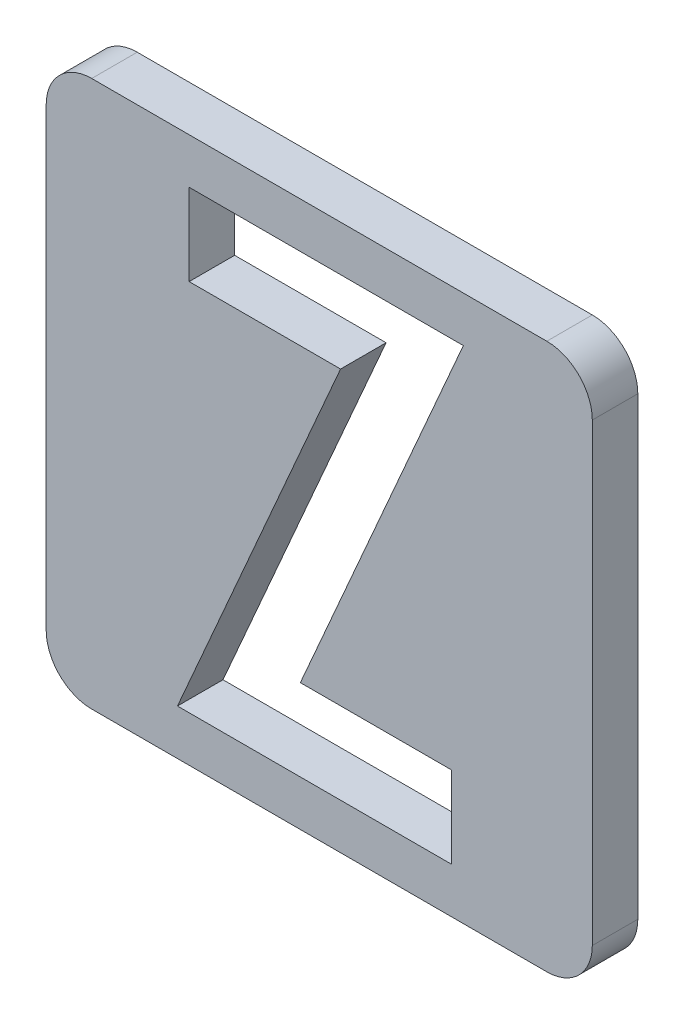
ISO-10303-21;
HEADER;
FILE_DESCRIPTION(('STEP AP214'),'2;1');
FILE_NAME('part.step','',(''),(''),'','','');
FILE_SCHEMA(('AUTOMOTIVE_DESIGN { 1 0 10303 214 1 1 1 1 }'));
ENDSEC;
DATA;
#1=APPLICATION_CONTEXT('core data for automotive mechanical design processes');
#2=APPLICATION_PROTOCOL_DEFINITION('international standard','automotive_design',2000,#1);
#3=PRODUCT_CONTEXT('',#1,'mechanical');
#4=PRODUCT('Part','Part','',(#3));
#5=PRODUCT_RELATED_PRODUCT_CATEGORY('part','',(#4));
#6=PRODUCT_DEFINITION_FORMATION('','',#4);
#7=PRODUCT_DEFINITION_CONTEXT('part definition',#1,'design');
#8=PRODUCT_DEFINITION('design','',#6,#7);
#9=PRODUCT_DEFINITION_SHAPE('','',#8);
#10=(LENGTH_UNIT() NAMED_UNIT(*) SI_UNIT(.MILLI.,.METRE.));
#11=(NAMED_UNIT(*) PLANE_ANGLE_UNIT() SI_UNIT($,.RADIAN.));
#12=(NAMED_UNIT(*) SI_UNIT($,.STERADIAN.) SOLID_ANGLE_UNIT());
#13=UNCERTAINTY_MEASURE_WITH_UNIT(LENGTH_MEASURE(1.E-05),#10,'distance_accuracy_value','');
#14=(GEOMETRIC_REPRESENTATION_CONTEXT(3) GLOBAL_UNCERTAINTY_ASSIGNED_CONTEXT((#13)) GLOBAL_UNIT_ASSIGNED_CONTEXT((#10,
#11,#12)) REPRESENTATION_CONTEXT('',''));
#15=CARTESIAN_POINT('',(0.,0.,0.));
#16=DIRECTION('',(0.,0.,1.));
#17=DIRECTION('',(1.,0.,0.));
#18=AXIS2_PLACEMENT_3D('',#15,#16,#17);
#19=CARTESIAN_POINT('',(50.,50.,10.));
#20=DIRECTION('',(0.,0.,-1.));
#21=DIRECTION('',(-1.,0.,0.));
#22=AXIS2_PLACEMENT_3D('',#19,#20,#21);
#23=PLANE('',#22);
#24=DIRECTION('',(1.,0.,0.));
#25=VECTOR('',#24,1.);
#26=CARTESIAN_POINT('',(-49.9999999999999,60.,10.));
#27=LINE('',#26,#25);
#28=CARTESIAN_POINT('',(-49.9999999999999,60.,10.));
#29=VERTEX_POINT('',#28);
#30=CARTESIAN_POINT('',(49.9999999999999,60.,10.));
#31=VERTEX_POINT('',#30);
#32=EDGE_CURVE('E213',#29,#31,#27,.T.);
#33=ORIENTED_EDGE('',*,*,#32,.F.);
#34=CARTESIAN_POINT('',(-50.,50.,10.));
#35=DIRECTION('',(0.,0.,1.));
#36=DIRECTION('',(1.,0.,0.));
#37=AXIS2_PLACEMENT_3D('',#34,#35,#36);
#38=CIRCLE('',#37,10.);
#39=CARTESIAN_POINT('',(-60.,49.9999999999999,10.));
#40=VERTEX_POINT('',#39);
#41=EDGE_CURVE('E231',#29,#40,#38,.T.);
#42=ORIENTED_EDGE('',*,*,#41,.T.);
#43=DIRECTION('',(0.,-1.,0.));
#44=VECTOR('',#43,1.);
#45=CARTESIAN_POINT('',(-60.,49.9999999999999,10.));
#46=LINE('',#45,#44);
#47=CARTESIAN_POINT('',(-60.,-49.9999999999999,10.));
#48=VERTEX_POINT('',#47);
#49=EDGE_CURVE('E229',#40,#48,#46,.T.);
#50=ORIENTED_EDGE('',*,*,#49,.T.);
#51=CARTESIAN_POINT('',(-50.,-50.,10.));
#52=DIRECTION('',(0.,0.,1.));
#53=DIRECTION('',(1.,0.,0.));
#54=AXIS2_PLACEMENT_3D('',#51,#52,#53);
#55=CIRCLE('',#54,10.);
#56=CARTESIAN_POINT('',(-49.9999999999999,-60.,10.));
#57=VERTEX_POINT('',#56);
#58=EDGE_CURVE('E227',#48,#57,#55,.T.);
#59=ORIENTED_EDGE('',*,*,#58,.T.);
#60=DIRECTION('',(1.,0.,0.));
#61=VECTOR('',#60,1.);
#62=CARTESIAN_POINT('',(-49.9999999999999,-60.,10.));
#63=LINE('',#62,#61);
#64=CARTESIAN_POINT('',(49.9999999999999,-60.,10.));
#65=VERTEX_POINT('',#64);
#66=EDGE_CURVE('E225',#57,#65,#63,.T.);
#67=ORIENTED_EDGE('',*,*,#66,.T.);
#68=CARTESIAN_POINT('',(50.,-50.,10.));
#69=DIRECTION('',(0.,0.,1.));
#70=DIRECTION('',(1.,0.,0.));
#71=AXIS2_PLACEMENT_3D('',#68,#69,#70);
#72=CIRCLE('',#71,10.);
#73=CARTESIAN_POINT('',(60.,-50.,10.));
#74=VERTEX_POINT('',#73);
#75=EDGE_CURVE('E223',#65,#74,#72,.T.);
#76=ORIENTED_EDGE('',*,*,#75,.T.);
#77=DIRECTION('',(0.,-1.,0.));
#78=VECTOR('',#77,1.);
#79=CARTESIAN_POINT('',(60.,49.9999999999999,10.));
#80=LINE('',#79,#78);
#81=CARTESIAN_POINT('',(60.,49.9999999999999,10.));
#82=VERTEX_POINT('',#81);
#83=EDGE_CURVE('E220',#82,#74,#80,.T.);
#84=ORIENTED_EDGE('',*,*,#83,.F.);
#85=CARTESIAN_POINT('',(50.,50.,10.));
#86=DIRECTION('',(0.,0.,-1.));
#87=DIRECTION('',(-1.,0.,0.));
#88=AXIS2_PLACEMENT_3D('',#85,#86,#87);
#89=CIRCLE('',#88,10.);
#90=EDGE_CURVE('E216',#31,#82,#89,.T.);
#91=ORIENTED_EDGE('',*,*,#90,.F.);
#92=EDGE_LOOP('',(#33,#42,#50,#59,#67,#76,#84,#91));
#93=FACE_BOUND('',#92,.T.);
#94=DIRECTION('',(0.,1.,0.));
#95=VECTOR('',#94,1.);
#96=CARTESIAN_POINT('',(-28.5897435897436,32.0512820512821,10.));
#97=LINE('',#96,#95);
#98=CARTESIAN_POINT('',(-28.5897435897436,32.0512820512821,10.));
#99=VERTEX_POINT('',#98);
#100=CARTESIAN_POINT('',(-28.5897435897436,50.,10.));
#101=VERTEX_POINT('',#100);
#102=EDGE_CURVE('E50',#99,#101,#97,.T.);
#103=ORIENTED_EDGE('',*,*,#102,.T.);
#104=DIRECTION('',(1.,0.,0.));
#105=VECTOR('',#104,1.);
#106=CARTESIAN_POINT('',(-28.5897435897436,50.,10.));
#107=LINE('',#106,#105);
#108=CARTESIAN_POINT('',(31.6666666666667,50.,10.));
#109=VERTEX_POINT('',#108);
#110=EDGE_CURVE('E162',#101,#109,#107,.T.);
#111=ORIENTED_EDGE('',*,*,#110,.T.);
#112=DIRECTION('',(-0.400067481501263,-0.916485684691931,0.));
#113=VECTOR('',#112,1.);
#114=CARTESIAN_POINT('',(31.6666666666667,50.,10.));
#115=LINE('',#114,#113);
#116=CARTESIAN_POINT('',(-4.15064102564103,-32.0512820512821,10.));
#117=VERTEX_POINT('',#116);
#118=EDGE_CURVE('E185',#109,#117,#115,.T.);
#119=ORIENTED_EDGE('',*,*,#118,.T.);
#120=DIRECTION('',(1.,0.,0.));
#121=VECTOR('',#120,1.);
#122=CARTESIAN_POINT('',(-4.15064102564103,-32.0512820512821,10.));
#123=LINE('',#122,#121);
#124=CARTESIAN_POINT('',(29.1025641025641,-32.0512820512821,10.));
#125=VERTEX_POINT('',#124);
#126=EDGE_CURVE('E188',#117,#125,#123,.T.);
#127=ORIENTED_EDGE('',*,*,#126,.T.);
#128=DIRECTION('',(0.,-1.,0.));
#129=VECTOR('',#128,1.);
#130=CARTESIAN_POINT('',(29.1025641025641,-32.0512820512821,10.));
#131=LINE('',#130,#129);
#132=CARTESIAN_POINT('',(29.1025641025641,-50.,10.));
#133=VERTEX_POINT('',#132);
#134=EDGE_CURVE('E191',#125,#133,#131,.T.);
#135=ORIENTED_EDGE('',*,*,#134,.T.);
#136=DIRECTION('',(-1.,0.,0.));
#137=VECTOR('',#136,1.);
#138=CARTESIAN_POINT('',(29.1025641025641,-50.,10.));
#139=LINE('',#138,#137);
#140=CARTESIAN_POINT('',(-31.1538461538462,-50.,10.));
#141=VERTEX_POINT('',#140);
#142=EDGE_CURVE('E194',#133,#141,#139,.T.);
#143=ORIENTED_EDGE('',*,*,#142,.T.);
#144=DIRECTION('',(0.400255395350612,0.916403632954783,0.));
#145=VECTOR('',#144,1.);
#146=CARTESIAN_POINT('',(-31.1538461538462,-50.,10.));
#147=LINE('',#146,#145);
#148=CARTESIAN_POINT('',(4.68349358974358,32.0512820512821,10.));
#149=VERTEX_POINT('',#148);
#150=EDGE_CURVE('E197',#141,#149,#147,.T.);
#151=ORIENTED_EDGE('',*,*,#150,.T.);
#152=DIRECTION('',(-1.,0.,0.));
#153=VECTOR('',#152,1.);
#154=CARTESIAN_POINT('',(4.68349358974358,32.0512820512821,10.));
#155=LINE('',#154,#153);
#156=EDGE_CURVE('E156',#149,#99,#155,.T.);
#157=ORIENTED_EDGE('',*,*,#156,.T.);
#158=EDGE_LOOP('',(#103,#111,#119,#127,#135,#143,#151,#157));
#159=FACE_BOUND('',#158,.T.);
#160=ADVANCED_FACE('F33',(#93,#159),#23,.F.);
#161=CARTESIAN_POINT('',(50.,50.,0.));
#162=DIRECTION('',(0.,0.,-1.));
#163=DIRECTION('',(-1.,0.,0.));
#164=AXIS2_PLACEMENT_3D('',#161,#162,#163);
#165=PLANE('',#164);
#166=DIRECTION('',(1.,0.,0.));
#167=VECTOR('',#166,1.);
#168=CARTESIAN_POINT('',(-49.9999999999999,60.,0.));
#169=LINE('',#168,#167);
#170=CARTESIAN_POINT('',(-49.9999999999999,60.,0.));
#171=VERTEX_POINT('',#170);
#172=CARTESIAN_POINT('',(49.9999999999999,60.,0.));
#173=VERTEX_POINT('',#172);
#174=EDGE_CURVE('E163',#171,#173,#169,.T.);
#175=ORIENTED_EDGE('',*,*,#174,.T.);
#176=CARTESIAN_POINT('',(50.,50.,0.));
#177=DIRECTION('',(0.,0.,-1.));
#178=DIRECTION('',(-1.,0.,0.));
#179=AXIS2_PLACEMENT_3D('',#176,#177,#178);
#180=CIRCLE('',#179,10.);
#181=CARTESIAN_POINT('',(60.,49.9999999999999,0.));
#182=VERTEX_POINT('',#181);
#183=EDGE_CURVE('E235',#173,#182,#180,.T.);
#184=ORIENTED_EDGE('',*,*,#183,.T.);
#185=DIRECTION('',(0.,-1.,0.));
#186=VECTOR('',#185,1.);
#187=CARTESIAN_POINT('',(60.,49.9999999999999,0.));
#188=LINE('',#187,#186);
#189=CARTESIAN_POINT('',(60.,-50.,0.));
#190=VERTEX_POINT('',#189);
#191=EDGE_CURVE('E238',#182,#190,#188,.T.);
#192=ORIENTED_EDGE('',*,*,#191,.T.);
#193=CARTESIAN_POINT('',(50.,-50.,0.));
#194=DIRECTION('',(0.,0.,1.));
#195=DIRECTION('',(1.,0.,0.));
#196=AXIS2_PLACEMENT_3D('',#193,#194,#195);
#197=CIRCLE('',#196,10.);
#198=CARTESIAN_POINT('',(49.9999999999999,-60.,0.));
#199=VERTEX_POINT('',#198);
#200=EDGE_CURVE('E241',#199,#190,#197,.T.);
#201=ORIENTED_EDGE('',*,*,#200,.F.);
#202=DIRECTION('',(1.,0.,0.));
#203=VECTOR('',#202,1.);
#204=CARTESIAN_POINT('',(-49.9999999999999,-60.,0.));
#205=LINE('',#204,#203);
#206=CARTESIAN_POINT('',(-49.9999999999999,-60.,0.));
#207=VERTEX_POINT('',#206);
#208=EDGE_CURVE('E244',#207,#199,#205,.T.);
#209=ORIENTED_EDGE('',*,*,#208,.F.);
#210=CARTESIAN_POINT('',(-50.,-50.,0.));
#211=DIRECTION('',(0.,0.,1.));
#212=DIRECTION('',(1.,0.,0.));
#213=AXIS2_PLACEMENT_3D('',#210,#211,#212);
#214=CIRCLE('',#213,10.);
#215=CARTESIAN_POINT('',(-60.,-49.9999999999999,0.));
#216=VERTEX_POINT('',#215);
#217=EDGE_CURVE('E246',#216,#207,#214,.T.);
#218=ORIENTED_EDGE('',*,*,#217,.F.);
#219=DIRECTION('',(0.,-1.,0.));
#220=VECTOR('',#219,1.);
#221=CARTESIAN_POINT('',(-60.,49.9999999999999,0.));
#222=LINE('',#221,#220);
#223=CARTESIAN_POINT('',(-60.,49.9999999999999,0.));
#224=VERTEX_POINT('',#223);
#225=EDGE_CURVE('E248',#224,#216,#222,.T.);
#226=ORIENTED_EDGE('',*,*,#225,.F.);
#227=CARTESIAN_POINT('',(-50.,50.,0.));
#228=DIRECTION('',(0.,0.,1.));
#229=DIRECTION('',(1.,0.,0.));
#230=AXIS2_PLACEMENT_3D('',#227,#228,#229);
#231=CIRCLE('',#230,10.);
#232=EDGE_CURVE('E217',#171,#224,#231,.T.);
#233=ORIENTED_EDGE('',*,*,#232,.F.);
#234=EDGE_LOOP('',(#175,#184,#192,#201,#209,#218,#226,#233));
#235=FACE_BOUND('',#234,.T.);
#236=DIRECTION('',(1.,0.,0.));
#237=VECTOR('',#236,1.);
#238=CARTESIAN_POINT('',(-28.5897435897436,50.,0.));
#239=LINE('',#238,#237);
#240=CARTESIAN_POINT('',(-28.5897435897436,50.,0.));
#241=VERTEX_POINT('',#240);
#242=CARTESIAN_POINT('',(31.6666666666667,50.,0.));
#243=VERTEX_POINT('',#242);
#244=EDGE_CURVE('E155',#241,#243,#239,.T.);
#245=ORIENTED_EDGE('',*,*,#244,.F.);
#246=DIRECTION('',(0.,1.,0.));
#247=VECTOR('',#246,1.);
#248=CARTESIAN_POINT('',(-28.5897435897436,32.0512820512821,0.));
#249=LINE('',#248,#247);
#250=CARTESIAN_POINT('',(-28.5897435897436,32.0512820512821,0.));
#251=VERTEX_POINT('',#250);
#252=EDGE_CURVE('E147',#251,#241,#249,.T.);
#253=ORIENTED_EDGE('',*,*,#252,.F.);
#254=DIRECTION('',(-1.,0.,0.));
#255=VECTOR('',#254,1.);
#256=CARTESIAN_POINT('',(4.68349358974358,32.0512820512821,0.));
#257=LINE('',#256,#255);
#258=CARTESIAN_POINT('',(4.68349358974358,32.0512820512821,0.));
#259=VERTEX_POINT('',#258);
#260=EDGE_CURVE('E181',#259,#251,#257,.T.);
#261=ORIENTED_EDGE('',*,*,#260,.F.);
#262=DIRECTION('',(0.400255395350612,0.916403632954783,0.));
#263=VECTOR('',#262,1.);
#264=CARTESIAN_POINT('',(-31.1538461538462,-50.,0.));
#265=LINE('',#264,#263);
#266=CARTESIAN_POINT('',(-31.1538461538462,-50.,0.));
#267=VERTEX_POINT('',#266);
#268=EDGE_CURVE('E179',#267,#259,#265,.T.);
#269=ORIENTED_EDGE('',*,*,#268,.F.);
#270=DIRECTION('',(-1.,0.,0.));
#271=VECTOR('',#270,1.);
#272=CARTESIAN_POINT('',(29.1025641025641,-50.,0.));
#273=LINE('',#272,#271);
#274=CARTESIAN_POINT('',(29.1025641025641,-50.,0.));
#275=VERTEX_POINT('',#274);
#276=EDGE_CURVE('E177',#275,#267,#273,.T.);
#277=ORIENTED_EDGE('',*,*,#276,.F.);
#278=DIRECTION('',(0.,-1.,0.));
#279=VECTOR('',#278,1.);
#280=CARTESIAN_POINT('',(29.1025641025641,-32.0512820512821,0.));
#281=LINE('',#280,#279);
#282=CARTESIAN_POINT('',(29.1025641025641,-32.0512820512821,0.));
#283=VERTEX_POINT('',#282);
#284=EDGE_CURVE('E175',#283,#275,#281,.T.);
#285=ORIENTED_EDGE('',*,*,#284,.F.);
#286=DIRECTION('',(1.,0.,0.));
#287=VECTOR('',#286,1.);
#288=CARTESIAN_POINT('',(-4.15064102564103,-32.0512820512821,0.));
#289=LINE('',#288,#287);
#290=CARTESIAN_POINT('',(-4.15064102564103,-32.0512820512821,0.));
#291=VERTEX_POINT('',#290);
#292=EDGE_CURVE('E171',#291,#283,#289,.T.);
#293=ORIENTED_EDGE('',*,*,#292,.F.);
#294=DIRECTION('',(-0.400067481501263,-0.916485684691931,0.));
#295=VECTOR('',#294,1.);
#296=CARTESIAN_POINT('',(31.6666666666667,50.,0.));
#297=LINE('',#296,#295);
#298=EDGE_CURVE('E169',#243,#291,#297,.T.);
#299=ORIENTED_EDGE('',*,*,#298,.F.);
#300=EDGE_LOOP('',(#245,#253,#261,#269,#277,#285,#293,#299));
#301=FACE_BOUND('',#300,.T.);
#302=ADVANCED_FACE('F167',(#235,#301),#165,.T.);
#303=CARTESIAN_POINT('',(-49.9999999999999,60.,10.));
#304=DIRECTION('',(0.,1.,0.));
#305=DIRECTION('',(0.,0.,1.));
#306=AXIS2_PLACEMENT_3D('',#303,#304,#305);
#307=PLANE('',#306);
#308=ORIENTED_EDGE('',*,*,#174,.F.);
#309=DIRECTION('',(0.,0.,-1.));
#310=VECTOR('',#309,1.);
#311=CARTESIAN_POINT('',(-49.9999999999999,60.,10.));
#312=LINE('',#311,#310);
#313=EDGE_CURVE('E11',#29,#171,#312,.T.);
#314=ORIENTED_EDGE('',*,*,#313,.F.);
#315=ORIENTED_EDGE('',*,*,#32,.T.);
#316=DIRECTION('',(0.,0.,-1.));
#317=VECTOR('',#316,1.);
#318=CARTESIAN_POINT('',(49.9999999999999,60.,10.));
#319=LINE('',#318,#317);
#320=EDGE_CURVE('E37',#31,#173,#319,.T.);
#321=ORIENTED_EDGE('',*,*,#320,.T.);
#322=EDGE_LOOP('',(#308,#314,#315,#321));
#323=FACE_BOUND('',#322,.T.);
#324=ADVANCED_FACE('F35',(#323),#307,.T.);
#325=CARTESIAN_POINT('',(-50.,50.,10.));
#326=DIRECTION('',(0.,0.,-1.));
#327=DIRECTION('',(-1.,0.,0.));
#328=AXIS2_PLACEMENT_3D('',#325,#326,#327);
#329=CYLINDRICAL_SURFACE('',#328,10.);
#330=ORIENTED_EDGE('',*,*,#232,.T.);
#331=DIRECTION('',(0.,0.,-1.));
#332=VECTOR('',#331,1.);
#333=CARTESIAN_POINT('',(-60.,49.9999999999999,10.));
#334=LINE('',#333,#332);
#335=EDGE_CURVE('E42',#40,#224,#334,.T.);
#336=ORIENTED_EDGE('',*,*,#335,.F.);
#337=ORIENTED_EDGE('',*,*,#41,.F.);
#338=ORIENTED_EDGE('',*,*,#313,.T.);
#339=EDGE_LOOP('',(#330,#336,#337,#338));
#340=FACE_BOUND('',#339,.T.);
#341=ADVANCED_FACE('F278',(#340),#329,.T.);
#342=CARTESIAN_POINT('',(-60.,49.9999999999999,10.));
#343=DIRECTION('',(1.,0.,0.));
#344=DIRECTION('',(0.,1.,0.));
#345=AXIS2_PLACEMENT_3D('',#342,#343,#344);
#346=PLANE('',#345);
#347=ORIENTED_EDGE('',*,*,#225,.T.);
#348=DIRECTION('',(0.,0.,-1.));
#349=VECTOR('',#348,1.);
#350=CARTESIAN_POINT('',(-60.,-49.9999999999999,10.));
#351=LINE('',#350,#349);
#352=EDGE_CURVE('E253',#48,#216,#351,.T.);
#353=ORIENTED_EDGE('',*,*,#352,.F.);
#354=ORIENTED_EDGE('',*,*,#49,.F.);
#355=ORIENTED_EDGE('',*,*,#335,.T.);
#356=EDGE_LOOP('',(#347,#353,#354,#355));
#357=FACE_BOUND('',#356,.T.);
#358=ADVANCED_FACE('F282',(#357),#346,.F.);
#359=CARTESIAN_POINT('',(-50.,-50.,10.));
#360=DIRECTION('',(0.,0.,-1.));
#361=DIRECTION('',(-1.,0.,0.));
#362=AXIS2_PLACEMENT_3D('',#359,#360,#361);
#363=CYLINDRICAL_SURFACE('',#362,10.);
#364=ORIENTED_EDGE('',*,*,#217,.T.);
#365=DIRECTION('',(0.,0.,-1.));
#366=VECTOR('',#365,1.);
#367=CARTESIAN_POINT('',(-49.9999999999999,-60.,10.));
#368=LINE('',#367,#366);
#369=EDGE_CURVE('E256',#57,#207,#368,.T.);
#370=ORIENTED_EDGE('',*,*,#369,.F.);
#371=ORIENTED_EDGE('',*,*,#58,.F.);
#372=ORIENTED_EDGE('',*,*,#352,.T.);
#373=EDGE_LOOP('',(#364,#370,#371,#372));
#374=FACE_BOUND('',#373,.T.);
#375=ADVANCED_FACE('F302',(#374),#363,.T.);
#376=CARTESIAN_POINT('',(-49.9999999999999,-60.,10.));
#377=DIRECTION('',(0.,1.,0.));
#378=DIRECTION('',(0.,0.,1.));
#379=AXIS2_PLACEMENT_3D('',#376,#377,#378);
#380=PLANE('',#379);
#381=ORIENTED_EDGE('',*,*,#208,.T.);
#382=DIRECTION('',(0.,0.,-1.));
#383=VECTOR('',#382,1.);
#384=CARTESIAN_POINT('',(49.9999999999999,-60.,10.));
#385=LINE('',#384,#383);
#386=EDGE_CURVE('E259',#65,#199,#385,.T.);
#387=ORIENTED_EDGE('',*,*,#386,.F.);
#388=ORIENTED_EDGE('',*,*,#66,.F.);
#389=ORIENTED_EDGE('',*,*,#369,.T.);
#390=EDGE_LOOP('',(#381,#387,#388,#389));
#391=FACE_BOUND('',#390,.T.);
#392=ADVANCED_FACE('F300',(#391),#380,.F.);
#393=CARTESIAN_POINT('',(50.,-50.,10.));
#394=DIRECTION('',(0.,0.,-1.));
#395=DIRECTION('',(-1.,0.,0.));
#396=AXIS2_PLACEMENT_3D('',#393,#394,#395);
#397=CYLINDRICAL_SURFACE('',#396,10.);
#398=ORIENTED_EDGE('',*,*,#200,.T.);
#399=DIRECTION('',(0.,0.,-1.));
#400=VECTOR('',#399,1.);
#401=CARTESIAN_POINT('',(60.,-50.,10.));
#402=LINE('',#401,#400);
#403=EDGE_CURVE('E262',#74,#190,#402,.T.);
#404=ORIENTED_EDGE('',*,*,#403,.F.);
#405=ORIENTED_EDGE('',*,*,#75,.F.);
#406=ORIENTED_EDGE('',*,*,#386,.T.);
#407=EDGE_LOOP('',(#398,#404,#405,#406));
#408=FACE_BOUND('',#407,.T.);
#409=ADVANCED_FACE('F296',(#408),#397,.T.);
#410=CARTESIAN_POINT('',(60.,49.9999999999999,10.));
#411=DIRECTION('',(1.,0.,0.));
#412=DIRECTION('',(0.,1.,0.));
#413=AXIS2_PLACEMENT_3D('',#410,#411,#412);
#414=PLANE('',#413);
#415=ORIENTED_EDGE('',*,*,#191,.F.);
#416=DIRECTION('',(0.,0.,-1.));
#417=VECTOR('',#416,1.);
#418=CARTESIAN_POINT('',(60.,49.9999999999999,10.));
#419=LINE('',#418,#417);
#420=EDGE_CURVE('E263',#82,#182,#419,.T.);
#421=ORIENTED_EDGE('',*,*,#420,.F.);
#422=ORIENTED_EDGE('',*,*,#83,.T.);
#423=ORIENTED_EDGE('',*,*,#403,.T.);
#424=EDGE_LOOP('',(#415,#421,#422,#423));
#425=FACE_BOUND('',#424,.T.);
#426=ADVANCED_FACE('F292',(#425),#414,.T.);
#427=CARTESIAN_POINT('',(50.,50.,10.));
#428=DIRECTION('',(0.,0.,-1.));
#429=DIRECTION('',(-1.,0.,0.));
#430=AXIS2_PLACEMENT_3D('',#427,#428,#429);
#431=CYLINDRICAL_SURFACE('',#430,10.);
#432=ORIENTED_EDGE('',*,*,#183,.F.);
#433=ORIENTED_EDGE('',*,*,#320,.F.);
#434=ORIENTED_EDGE('',*,*,#90,.T.);
#435=ORIENTED_EDGE('',*,*,#420,.T.);
#436=EDGE_LOOP('',(#432,#433,#434,#435));
#437=FACE_BOUND('',#436,.T.);
#438=ADVANCED_FACE('F271',(#437),#431,.T.);
#439=CARTESIAN_POINT('',(-28.5897435897436,32.0512820512821,0.));
#440=DIRECTION('',(1.,0.,0.));
#441=DIRECTION('',(0.,0.,-1.));
#442=AXIS2_PLACEMENT_3D('',#439,#440,#441);
#443=PLANE('',#442);
#444=ORIENTED_EDGE('',*,*,#102,.F.);
#445=DIRECTION('',(0.,0.,1.));
#446=VECTOR('',#445,1.);
#447=CARTESIAN_POINT('',(-28.5897435897436,32.0512820512821,0.));
#448=LINE('',#447,#446);
#449=EDGE_CURVE('E151',#251,#99,#448,.T.);
#450=ORIENTED_EDGE('',*,*,#449,.F.);
#451=ORIENTED_EDGE('',*,*,#252,.T.);
#452=DIRECTION('',(0.,0.,1.));
#453=VECTOR('',#452,1.);
#454=CARTESIAN_POINT('',(-28.5897435897436,50.,0.));
#455=LINE('',#454,#453);
#456=EDGE_CURVE('E150',#241,#101,#455,.T.);
#457=ORIENTED_EDGE('',*,*,#456,.T.);
#458=EDGE_LOOP('',(#444,#450,#451,#457));
#459=FACE_BOUND('',#458,.T.);
#460=ADVANCED_FACE('F149',(#459),#443,.T.);
#461=CARTESIAN_POINT('',(-28.5897435897436,50.,0.));
#462=DIRECTION('',(0.,-1.,0.));
#463=DIRECTION('',(0.,0.,-1.));
#464=AXIS2_PLACEMENT_3D('',#461,#462,#463);
#465=PLANE('',#464);
#466=ORIENTED_EDGE('',*,*,#110,.F.);
#467=ORIENTED_EDGE('',*,*,#456,.F.);
#468=ORIENTED_EDGE('',*,*,#244,.T.);
#469=DIRECTION('',(0.,0.,1.));
#470=VECTOR('',#469,1.);
#471=CARTESIAN_POINT('',(31.6666666666667,50.,0.));
#472=LINE('',#471,#470);
#473=EDGE_CURVE('E164',#243,#109,#472,.T.);
#474=ORIENTED_EDGE('',*,*,#473,.T.);
#475=EDGE_LOOP('',(#466,#467,#468,#474));
#476=FACE_BOUND('',#475,.T.);
#477=ADVANCED_FACE('F159',(#476),#465,.T.);
#478=CARTESIAN_POINT('',(31.6666666666667,50.,0.));
#479=DIRECTION('',(-0.916485684691931,0.400067481501263,0.));
#480=DIRECTION('',(-0.400067481501263,-0.916485684691931,0.));
#481=AXIS2_PLACEMENT_3D('',#478,#479,#480);
#482=PLANE('',#481);
#483=ORIENTED_EDGE('',*,*,#118,.F.);
#484=ORIENTED_EDGE('',*,*,#473,.F.);
#485=ORIENTED_EDGE('',*,*,#298,.T.);
#486=DIRECTION('',(0.,0.,1.));
#487=VECTOR('',#486,1.);
#488=CARTESIAN_POINT('',(-4.15064102564103,-32.0512820512821,0.));
#489=LINE('',#488,#487);
#490=EDGE_CURVE('E210',#291,#117,#489,.T.);
#491=ORIENTED_EDGE('',*,*,#490,.T.);
#492=EDGE_LOOP('',(#483,#484,#485,#491));
#493=FACE_BOUND('',#492,.T.);
#494=ADVANCED_FACE('F351',(#493),#482,.T.);
#495=CARTESIAN_POINT('',(-4.15064102564103,-32.0512820512821,0.));
#496=DIRECTION('',(0.,-1.,0.));
#497=DIRECTION('',(0.,0.,-1.));
#498=AXIS2_PLACEMENT_3D('',#495,#496,#497);
#499=PLANE('',#498);
#500=ORIENTED_EDGE('',*,*,#126,.F.);
#501=ORIENTED_EDGE('',*,*,#490,.F.);
#502=ORIENTED_EDGE('',*,*,#292,.T.);
#503=DIRECTION('',(0.,0.,1.));
#504=VECTOR('',#503,1.);
#505=CARTESIAN_POINT('',(29.1025641025641,-32.0512820512821,0.));
#506=LINE('',#505,#504);
#507=EDGE_CURVE('E208',#283,#125,#506,.T.);
#508=ORIENTED_EDGE('',*,*,#507,.T.);
#509=EDGE_LOOP('',(#500,#501,#502,#508));
#510=FACE_BOUND('',#509,.T.);
#511=ADVANCED_FACE('F359',(#510),#499,.T.);
#512=CARTESIAN_POINT('',(29.1025641025641,-32.0512820512821,0.));
#513=DIRECTION('',(-1.,0.,0.));
#514=DIRECTION('',(0.,0.,1.));
#515=AXIS2_PLACEMENT_3D('',#512,#513,#514);
#516=PLANE('',#515);
#517=ORIENTED_EDGE('',*,*,#134,.F.);
#518=ORIENTED_EDGE('',*,*,#507,.F.);
#519=ORIENTED_EDGE('',*,*,#284,.T.);
#520=DIRECTION('',(0.,0.,1.));
#521=VECTOR('',#520,1.);
#522=CARTESIAN_POINT('',(29.1025641025641,-50.,0.));
#523=LINE('',#522,#521);
#524=EDGE_CURVE('E206',#275,#133,#523,.T.);
#525=ORIENTED_EDGE('',*,*,#524,.T.);
#526=EDGE_LOOP('',(#517,#518,#519,#525));
#527=FACE_BOUND('',#526,.T.);
#528=ADVANCED_FACE('F369',(#527),#516,.T.);
#529=CARTESIAN_POINT('',(29.1025641025641,-50.,0.));
#530=DIRECTION('',(0.,1.,0.));
#531=DIRECTION('',(0.,0.,1.));
#532=AXIS2_PLACEMENT_3D('',#529,#530,#531);
#533=PLANE('',#532);
#534=ORIENTED_EDGE('',*,*,#142,.F.);
#535=ORIENTED_EDGE('',*,*,#524,.F.);
#536=ORIENTED_EDGE('',*,*,#276,.T.);
#537=DIRECTION('',(0.,0.,1.));
#538=VECTOR('',#537,1.);
#539=CARTESIAN_POINT('',(-31.1538461538462,-50.,0.));
#540=LINE('',#539,#538);
#541=EDGE_CURVE('E204',#267,#141,#540,.T.);
#542=ORIENTED_EDGE('',*,*,#541,.T.);
#543=EDGE_LOOP('',(#534,#535,#536,#542));
#544=FACE_BOUND('',#543,.T.);
#545=ADVANCED_FACE('F379',(#544),#533,.T.);
#546=CARTESIAN_POINT('',(-31.1538461538462,-50.,0.));
#547=DIRECTION('',(0.916403632954783,-0.400255395350612,0.));
#548=DIRECTION('',(0.400255395350612,0.916403632954783,0.));
#549=AXIS2_PLACEMENT_3D('',#546,#547,#548);
#550=PLANE('',#549);
#551=ORIENTED_EDGE('',*,*,#150,.F.);
#552=ORIENTED_EDGE('',*,*,#541,.F.);
#553=ORIENTED_EDGE('',*,*,#268,.T.);
#554=DIRECTION('',(0.,0.,1.));
#555=VECTOR('',#554,1.);
#556=CARTESIAN_POINT('',(4.68349358974358,32.0512820512821,0.));
#557=LINE('',#556,#555);
#558=EDGE_CURVE('E58',#259,#149,#557,.T.);
#559=ORIENTED_EDGE('',*,*,#558,.T.);
#560=EDGE_LOOP('',(#551,#552,#553,#559));
#561=FACE_BOUND('',#560,.T.);
#562=ADVANCED_FACE('F389',(#561),#550,.T.);
#563=CARTESIAN_POINT('',(4.68349358974358,32.0512820512821,0.));
#564=DIRECTION('',(0.,1.,0.));
#565=DIRECTION('',(0.,0.,1.));
#566=AXIS2_PLACEMENT_3D('',#563,#564,#565);
#567=PLANE('',#566);
#568=ORIENTED_EDGE('',*,*,#156,.F.);
#569=ORIENTED_EDGE('',*,*,#558,.F.);
#570=ORIENTED_EDGE('',*,*,#260,.T.);
#571=ORIENTED_EDGE('',*,*,#449,.T.);
#572=EDGE_LOOP('',(#568,#569,#570,#571));
#573=FACE_BOUND('',#572,.T.);
#574=ADVANCED_FACE('F399',(#573),#567,.T.);
#575=CLOSED_SHELL('',(#160,#302,#324,#341,#358,#375,#392,#409,#426,#438,#460,#477,#494,#511,
#528,#545,#562,#574));
#576=MANIFOLD_SOLID_BREP('B2',#575);
#577=ADVANCED_BREP_SHAPE_REPRESENTATION('',(#18,#576),#14);
#578=SHAPE_DEFINITION_REPRESENTATION(#9,#577);
ENDSEC;
END-ISO-10303-21;
